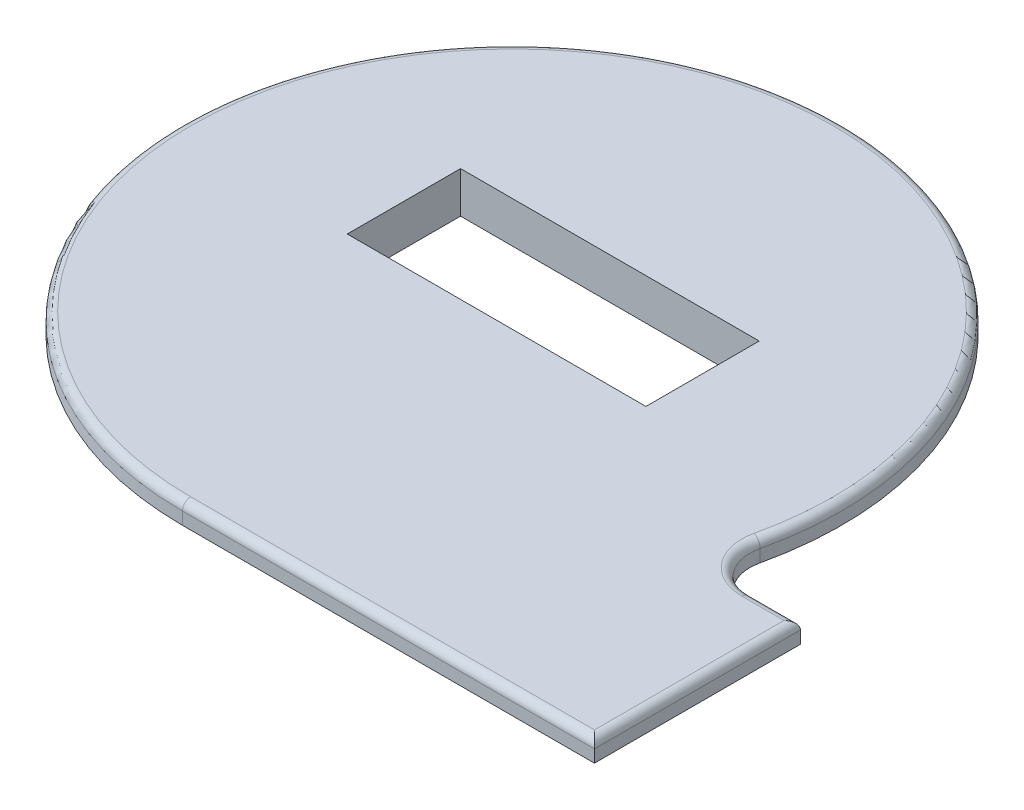
ISO-10303-21;
HEADER;
FILE_DESCRIPTION(('STEP AP214'),'2;1');
FILE_NAME('part.step','',(''),(''),'','','');
FILE_SCHEMA(('AUTOMOTIVE_DESIGN { 1 0 10303 214 1 1 1 1 }'));
ENDSEC;
DATA;
#1=APPLICATION_CONTEXT('core data for automotive mechanical design processes');
#2=APPLICATION_PROTOCOL_DEFINITION('international standard','automotive_design',2000,#1);
#3=PRODUCT_CONTEXT('',#1,'mechanical');
#4=PRODUCT('Part','Part','',(#3));
#5=PRODUCT_RELATED_PRODUCT_CATEGORY('part','',(#4));
#6=PRODUCT_DEFINITION_FORMATION('','',#4);
#7=PRODUCT_DEFINITION_CONTEXT('part definition',#1,'design');
#8=PRODUCT_DEFINITION('design','',#6,#7);
#9=PRODUCT_DEFINITION_SHAPE('','',#8);
#10=(LENGTH_UNIT() NAMED_UNIT(*) SI_UNIT(.MILLI.,.METRE.));
#11=(NAMED_UNIT(*) PLANE_ANGLE_UNIT() SI_UNIT($,.RADIAN.));
#12=(NAMED_UNIT(*) SI_UNIT($,.STERADIAN.) SOLID_ANGLE_UNIT());
#13=UNCERTAINTY_MEASURE_WITH_UNIT(LENGTH_MEASURE(1.E-05),#10,'distance_accuracy_value','');
#14=(GEOMETRIC_REPRESENTATION_CONTEXT(3) GLOBAL_UNCERTAINTY_ASSIGNED_CONTEXT((#13)) GLOBAL_UNIT_ASSIGNED_CONTEXT((#10,
#11,#12)) REPRESENTATION_CONTEXT('',''));
#15=CARTESIAN_POINT('',(0.,0.,0.));
#16=DIRECTION('',(0.,0.,1.));
#17=DIRECTION('',(1.,0.,0.));
#18=AXIS2_PLACEMENT_3D('',#15,#16,#17);
#19=CARTESIAN_POINT('',(0.,0.,0.));
#20=DIRECTION('',(0.,1.,0.));
#21=DIRECTION('',(0.,0.,1.));
#22=AXIS2_PLACEMENT_3D('',#19,#20,#21);
#23=PLANE('',#22);
#24=CARTESIAN_POINT('',(0.,0.,0.));
#25=DIRECTION('',(0.,1.,0.));
#26=DIRECTION('',(0.,0.,1.));
#27=AXIS2_PLACEMENT_3D('',#24,#25,#26);
#28=CIRCLE('',#27,80.);
#29=CARTESIAN_POINT('',(77.9996834434855,0.,17.7777777777778));
#30=VERTEX_POINT('',#29);
#31=CARTESIAN_POINT('',(0.,0.,80.));
#32=VERTEX_POINT('',#31);
#33=EDGE_CURVE('E260',#30,#32,#28,.T.);
#34=ORIENTED_EDGE('',*,*,#33,.F.);
#35=CARTESIAN_POINT('',(87.7496438739212,0.,20.));
#36=DIRECTION('',(0.,1.,0.));
#37=DIRECTION('',(0.,0.,1.));
#38=AXIS2_PLACEMENT_3D('',#35,#36,#37);
#39=CIRCLE('',#38,10.);
#40=CARTESIAN_POINT('',(87.7496438739212,0.,30.));
#41=VERTEX_POINT('',#40);
#42=EDGE_CURVE('E301',#30,#41,#39,.T.);
#43=ORIENTED_EDGE('',*,*,#42,.T.);
#44=DIRECTION('',(-1.,0.,0.));
#45=VECTOR('',#44,1.);
#46=CARTESIAN_POINT('',(100.,0.,30.));
#47=LINE('',#46,#45);
#48=CARTESIAN_POINT('',(100.,0.,30.));
#49=VERTEX_POINT('',#48);
#50=EDGE_CURVE('E272',#49,#41,#47,.T.);
#51=ORIENTED_EDGE('',*,*,#50,.F.);
#52=DIRECTION('',(0.,0.,-1.));
#53=VECTOR('',#52,1.);
#54=CARTESIAN_POINT('',(100.,0.,80.));
#55=LINE('',#54,#53);
#56=CARTESIAN_POINT('',(100.,0.,80.));
#57=VERTEX_POINT('',#56);
#58=EDGE_CURVE('E268',#57,#49,#55,.T.);
#59=ORIENTED_EDGE('',*,*,#58,.F.);
#60=DIRECTION('',(1.,0.,0.));
#61=VECTOR('',#60,1.);
#62=CARTESIAN_POINT('',(0.,0.,80.));
#63=LINE('',#62,#61);
#64=EDGE_CURVE('E264',#32,#57,#63,.T.);
#65=ORIENTED_EDGE('',*,*,#64,.F.);
#66=EDGE_LOOP('',(#34,#43,#51,#59,#65));
#67=FACE_BOUND('',#66,.T.);
#68=DIRECTION('',(1.,0.,0.));
#69=VECTOR('',#68,1.);
#70=CARTESIAN_POINT('',(94.8,0.,35.2));
#71=LINE('',#70,#69);
#72=CARTESIAN_POINT('',(80.9691299199887,0.,35.2));
#73=VERTEX_POINT('',#72);
#74=CARTESIAN_POINT('',(94.8,0.,35.2));
#75=VERTEX_POINT('',#74);
#76=EDGE_CURVE('E239',#73,#75,#71,.T.);
#77=ORIENTED_EDGE('',*,*,#76,.F.);
#78=CARTESIAN_POINT('',(80.9691299199887,0.,25.2));
#79=DIRECTION('',(0.,1.,0.));
#80=DIRECTION('',(0.,0.,1.));
#81=AXIS2_PLACEMENT_3D('',#78,#79,#80);
#82=CIRCLE('',#81,10.);
#83=CARTESIAN_POINT('',(71.4208834671598,0.,22.2283018867924));
#84=VERTEX_POINT('',#83);
#85=EDGE_CURVE('E288',#73,#84,#82,.F.);
#86=ORIENTED_EDGE('',*,*,#85,.T.);
#87=CARTESIAN_POINT('',(0.,0.,0.));
#88=DIRECTION('',(0.,-1.,0.));
#89=DIRECTION('',(0.,0.,-1.));
#90=AXIS2_PLACEMENT_3D('',#87,#88,#89);
#91=CIRCLE('',#90,74.8);
#92=CARTESIAN_POINT('',(0.,0.,74.8));
#93=VERTEX_POINT('',#92);
#94=EDGE_CURVE('E230',#93,#84,#91,.T.);
#95=ORIENTED_EDGE('',*,*,#94,.F.);
#96=DIRECTION('',(-1.,0.,0.));
#97=VECTOR('',#96,1.);
#98=CARTESIAN_POINT('',(0.,0.,74.8));
#99=LINE('',#98,#97);
#100=CARTESIAN_POINT('',(94.8,0.,74.8));
#101=VERTEX_POINT('',#100);
#102=EDGE_CURVE('E247',#101,#93,#99,.T.);
#103=ORIENTED_EDGE('',*,*,#102,.F.);
#104=DIRECTION('',(0.,0.,1.));
#105=VECTOR('',#104,1.);
#106=CARTESIAN_POINT('',(94.8,0.,74.8));
#107=LINE('',#106,#105);
#108=EDGE_CURVE('E243',#75,#101,#107,.T.);
#109=ORIENTED_EDGE('',*,*,#108,.F.);
#110=EDGE_LOOP('',(#77,#86,#95,#103,#109));
#111=FACE_BOUND('',#110,.T.);
#112=ADVANCED_FACE('F43',(#67,#111),#23,.F.);
#113=CARTESIAN_POINT('',(0.,5.,0.));
#114=DIRECTION('',(0.,-1.,0.));
#115=DIRECTION('',(0.,0.,-1.));
#116=AXIS2_PLACEMENT_3D('',#113,#114,#115);
#117=CYLINDRICAL_SURFACE('',#116,80.);
#118=DIRECTION('',(0.,-1.,0.));
#119=VECTOR('',#118,1.);
#120=CARTESIAN_POINT('',(0.,5.,80.));
#121=LINE('',#120,#119);
#122=CARTESIAN_POINT('',(0.,3.,80.));
#123=VERTEX_POINT('',#122);
#124=EDGE_CURVE('E282',#123,#32,#121,.T.);
#125=ORIENTED_EDGE('',*,*,#124,.F.);
#126=CARTESIAN_POINT('',(0.,3.,0.));
#127=DIRECTION('',(0.,1.,0.));
#128=DIRECTION('',(0.,0.,1.));
#129=AXIS2_PLACEMENT_3D('',#126,#127,#128);
#130=CIRCLE('',#129,80.);
#131=CARTESIAN_POINT('',(77.9996834434855,3.,17.7777777777778));
#132=VERTEX_POINT('',#131);
#133=EDGE_CURVE('E327',#123,#132,#130,.F.);
#134=ORIENTED_EDGE('',*,*,#133,.T.);
#135=DIRECTION('',(0.,-1.,0.));
#136=VECTOR('',#135,1.);
#137=CARTESIAN_POINT('',(77.9996834434855,5.,17.7777777777778));
#138=LINE('',#137,#136);
#139=EDGE_CURVE('E294',#132,#30,#138,.T.);
#140=ORIENTED_EDGE('',*,*,#139,.T.);
#141=ORIENTED_EDGE('',*,*,#33,.T.);
#142=EDGE_LOOP('',(#125,#134,#140,#141));
#143=FACE_BOUND('',#142,.T.);
#144=ADVANCED_FACE('F436',(#143),#117,.T.);
#145=CARTESIAN_POINT('',(0.,5.,80.));
#146=DIRECTION('',(0.,0.,-1.));
#147=DIRECTION('',(-1.,0.,0.));
#148=AXIS2_PLACEMENT_3D('',#145,#146,#147);
#149=PLANE('',#148);
#150=DIRECTION('',(0.,-1.,0.));
#151=VECTOR('',#150,1.);
#152=CARTESIAN_POINT('',(100.,5.,80.));
#153=LINE('',#152,#151);
#154=CARTESIAN_POINT('',(100.,3.,80.));
#155=VERTEX_POINT('',#154);
#156=EDGE_CURVE('E279',#155,#57,#153,.T.);
#157=ORIENTED_EDGE('',*,*,#156,.F.);
#158=DIRECTION('',(1.,0.,0.));
#159=VECTOR('',#158,1.);
#160=CARTESIAN_POINT('',(0.,3.,80.));
#161=LINE('',#160,#159);
#162=EDGE_CURVE('E330',#155,#123,#161,.F.);
#163=ORIENTED_EDGE('',*,*,#162,.T.);
#164=ORIENTED_EDGE('',*,*,#124,.T.);
#165=ORIENTED_EDGE('',*,*,#64,.T.);
#166=EDGE_LOOP('',(#157,#163,#164,#165));
#167=FACE_BOUND('',#166,.T.);
#168=ADVANCED_FACE('F443',(#167),#149,.F.);
#169=CARTESIAN_POINT('',(100.,5.,80.));
#170=DIRECTION('',(-1.,0.,0.));
#171=DIRECTION('',(0.,0.,1.));
#172=AXIS2_PLACEMENT_3D('',#169,#170,#171);
#173=PLANE('',#172);
#174=DIRECTION('',(0.,-1.,0.));
#175=VECTOR('',#174,1.);
#176=CARTESIAN_POINT('',(100.,5.,30.));
#177=LINE('',#176,#175);
#178=CARTESIAN_POINT('',(100.,3.,30.));
#179=VERTEX_POINT('',#178);
#180=EDGE_CURVE('E276',#179,#49,#177,.T.);
#181=ORIENTED_EDGE('',*,*,#180,.F.);
#182=DIRECTION('',(0.,0.,-1.));
#183=VECTOR('',#182,1.);
#184=CARTESIAN_POINT('',(100.,3.,80.));
#185=LINE('',#184,#183);
#186=EDGE_CURVE('E333',#179,#155,#185,.F.);
#187=ORIENTED_EDGE('',*,*,#186,.T.);
#188=ORIENTED_EDGE('',*,*,#156,.T.);
#189=ORIENTED_EDGE('',*,*,#58,.T.);
#190=EDGE_LOOP('',(#181,#187,#188,#189));
#191=FACE_BOUND('',#190,.T.);
#192=ADVANCED_FACE('F455',(#191),#173,.F.);
#193=CARTESIAN_POINT('',(100.,5.,30.));
#194=DIRECTION('',(0.,0.,1.));
#195=DIRECTION('',(1.,0.,0.));
#196=AXIS2_PLACEMENT_3D('',#193,#194,#195);
#197=PLANE('',#196);
#198=DIRECTION('',(0.,1.,0.));
#199=VECTOR('',#198,1.);
#200=CARTESIAN_POINT('',(87.7496438739212,5.,30.));
#201=LINE('',#200,#199);
#202=CARTESIAN_POINT('',(87.7496438739212,3.,30.));
#203=VERTEX_POINT('',#202);
#204=EDGE_CURVE('E297',#41,#203,#201,.T.);
#205=ORIENTED_EDGE('',*,*,#204,.T.);
#206=DIRECTION('',(-1.,0.,0.));
#207=VECTOR('',#206,1.);
#208=CARTESIAN_POINT('',(100.,3.,30.));
#209=LINE('',#208,#207);
#210=EDGE_CURVE('E320',#203,#179,#209,.F.);
#211=ORIENTED_EDGE('',*,*,#210,.T.);
#212=ORIENTED_EDGE('',*,*,#180,.T.);
#213=ORIENTED_EDGE('',*,*,#50,.T.);
#214=EDGE_LOOP('',(#205,#211,#212,#213));
#215=FACE_BOUND('',#214,.T.);
#216=ADVANCED_FACE('F452',(#215),#197,.F.);
#217=CARTESIAN_POINT('',(0.,5.,0.));
#218=DIRECTION('',(0.,1.,0.));
#219=DIRECTION('',(0.,0.,1.));
#220=AXIS2_PLACEMENT_3D('',#217,#218,#219);
#221=PLANE('',#220);
#222=DIRECTION('',(0.,0.,-1.));
#223=VECTOR('',#222,1.);
#224=CARTESIAN_POINT('',(98.,5.,30.));
#225=LINE('',#224,#223);
#226=CARTESIAN_POINT('',(98.,5.,78.));
#227=VERTEX_POINT('',#226);
#228=CARTESIAN_POINT('',(98.,5.,32.));
#229=VERTEX_POINT('',#228);
#230=EDGE_CURVE('E304',#227,#229,#225,.T.);
#231=ORIENTED_EDGE('',*,*,#230,.T.);
#232=DIRECTION('',(-1.,0.,0.));
#233=VECTOR('',#232,1.);
#234=CARTESIAN_POINT('',(87.7496438739212,5.,32.));
#235=LINE('',#234,#233);
#236=CARTESIAN_POINT('',(87.7496438739212,5.,32.));
#237=VERTEX_POINT('',#236);
#238=EDGE_CURVE('E316',#229,#237,#235,.T.);
#239=ORIENTED_EDGE('',*,*,#238,.T.);
#240=CARTESIAN_POINT('',(87.7496438739212,5.,20.));
#241=DIRECTION('',(0.,1.,0.));
#242=DIRECTION('',(0.,0.,1.));
#243=AXIS2_PLACEMENT_3D('',#240,#241,#242);
#244=CIRCLE('',#243,12.);
#245=CARTESIAN_POINT('',(76.0496913573984,5.,17.3333333333333));
#246=VERTEX_POINT('',#245);
#247=EDGE_CURVE('E313',#237,#246,#244,.F.);
#248=ORIENTED_EDGE('',*,*,#247,.T.);
#249=CARTESIAN_POINT('',(0.,5.,0.));
#250=DIRECTION('',(0.,1.,0.));
#251=DIRECTION('',(0.,0.,1.));
#252=AXIS2_PLACEMENT_3D('',#249,#250,#251);
#253=CIRCLE('',#252,78.);
#254=CARTESIAN_POINT('',(0.,5.,78.));
#255=VERTEX_POINT('',#254);
#256=EDGE_CURVE('E310',#246,#255,#253,.T.);
#257=ORIENTED_EDGE('',*,*,#256,.T.);
#258=DIRECTION('',(1.,0.,0.));
#259=VECTOR('',#258,1.);
#260=CARTESIAN_POINT('',(100.,5.,78.));
#261=LINE('',#260,#259);
#262=EDGE_CURVE('E307',#255,#227,#261,.T.);
#263=ORIENTED_EDGE('',*,*,#262,.T.);
#264=EDGE_LOOP('',(#231,#239,#248,#257,#263));
#265=FACE_BOUND('',#264,.T.);
#266=DIRECTION('',(0.,0.,-1.));
#267=VECTOR('',#266,1.);
#268=CARTESIAN_POINT('',(36.25,5.,3.75));
#269=LINE('',#268,#267);
#270=CARTESIAN_POINT('',(36.25,5.,3.75));
#271=VERTEX_POINT('',#270);
#272=CARTESIAN_POINT('',(36.25,5.,-23.75));
#273=VERTEX_POINT('',#272);
#274=EDGE_CURVE('E184',#271,#273,#269,.T.);
#275=ORIENTED_EDGE('',*,*,#274,.F.);
#276=DIRECTION('',(1.,0.,0.));
#277=VECTOR('',#276,1.);
#278=CARTESIAN_POINT('',(-36.25,5.,3.75));
#279=LINE('',#278,#277);
#280=CARTESIAN_POINT('',(-36.25,5.,3.75));
#281=VERTEX_POINT('',#280);
#282=EDGE_CURVE('E204',#281,#271,#279,.T.);
#283=ORIENTED_EDGE('',*,*,#282,.F.);
#284=DIRECTION('',(0.,0.,1.));
#285=VECTOR('',#284,1.);
#286=CARTESIAN_POINT('',(-36.25,5.,3.75));
#287=LINE('',#286,#285);
#288=CARTESIAN_POINT('',(-36.25,5.,-23.75));
#289=VERTEX_POINT('',#288);
#290=EDGE_CURVE('E208',#289,#281,#287,.T.);
#291=ORIENTED_EDGE('',*,*,#290,.F.);
#292=DIRECTION('',(-1.,0.,0.));
#293=VECTOR('',#292,1.);
#294=CARTESIAN_POINT('',(-36.25,5.,-23.75));
#295=LINE('',#294,#293);
#296=EDGE_CURVE('E220',#273,#289,#295,.T.);
#297=ORIENTED_EDGE('',*,*,#296,.F.);
#298=EDGE_LOOP('',(#275,#283,#291,#297));
#299=FACE_BOUND('',#298,.T.);
#300=ADVANCED_FACE('F450',(#265,#299),#221,.T.);
#301=CARTESIAN_POINT('',(0.,-5.,0.));
#302=DIRECTION('',(0.,1.,0.));
#303=DIRECTION('',(0.,0.,1.));
#304=AXIS2_PLACEMENT_3D('',#301,#302,#303);
#305=CYLINDRICAL_SURFACE('',#304,74.8);
#306=DIRECTION('',(0.,1.,0.));
#307=VECTOR('',#306,1.);
#308=CARTESIAN_POINT('',(71.4208834671598,-5.,22.2283018867924));
#309=LINE('',#308,#307);
#310=CARTESIAN_POINT('',(71.4208834671598,-3.,22.2283018867924));
#311=VERTEX_POINT('',#310);
#312=EDGE_CURVE('E291',#84,#311,#309,.F.);
#313=ORIENTED_EDGE('',*,*,#312,.T.);
#314=CARTESIAN_POINT('',(0.,-3.,0.));
#315=DIRECTION('',(0.,-1.,0.));
#316=DIRECTION('',(0.,0.,-1.));
#317=AXIS2_PLACEMENT_3D('',#314,#315,#316);
#318=CIRCLE('',#317,74.8);
#319=CARTESIAN_POINT('',(0.,-3.,74.8));
#320=VERTEX_POINT('',#319);
#321=EDGE_CURVE('E11',#311,#320,#318,.F.);
#322=ORIENTED_EDGE('',*,*,#321,.T.);
#323=DIRECTION('',(0.,1.,0.));
#324=VECTOR('',#323,1.);
#325=CARTESIAN_POINT('',(0.,-5.,74.8));
#326=LINE('',#325,#324);
#327=EDGE_CURVE('E251',#320,#93,#326,.T.);
#328=ORIENTED_EDGE('',*,*,#327,.T.);
#329=ORIENTED_EDGE('',*,*,#94,.T.);
#330=EDGE_LOOP('',(#313,#322,#328,#329));
#331=FACE_BOUND('',#330,.T.);
#332=ADVANCED_FACE('F570',(#331),#305,.T.);
#333=CARTESIAN_POINT('',(94.8,-5.,35.2));
#334=DIRECTION('',(0.,0.,1.));
#335=DIRECTION('',(1.,0.,0.));
#336=AXIS2_PLACEMENT_3D('',#333,#334,#335);
#337=PLANE('',#336);
#338=DIRECTION('',(0.,1.,0.));
#339=VECTOR('',#338,1.);
#340=CARTESIAN_POINT('',(94.8,-5.,35.2));
#341=LINE('',#340,#339);
#342=CARTESIAN_POINT('',(94.8,-3.,35.2));
#343=VERTEX_POINT('',#342);
#344=EDGE_CURVE('E257',#343,#75,#341,.T.);
#345=ORIENTED_EDGE('',*,*,#344,.F.);
#346=DIRECTION('',(1.,0.,0.));
#347=VECTOR('',#346,1.);
#348=CARTESIAN_POINT('',(80.9691299199887,-3.,35.2));
#349=LINE('',#348,#347);
#350=CARTESIAN_POINT('',(80.9691299199887,-3.,35.2));
#351=VERTEX_POINT('',#350);
#352=EDGE_CURVE('E53',#343,#351,#349,.F.);
#353=ORIENTED_EDGE('',*,*,#352,.T.);
#354=DIRECTION('',(0.,-1.,0.));
#355=VECTOR('',#354,1.);
#356=CARTESIAN_POINT('',(80.9691299199887,0.,35.2));
#357=LINE('',#356,#355);
#358=EDGE_CURVE('E285',#351,#73,#357,.F.);
#359=ORIENTED_EDGE('',*,*,#358,.T.);
#360=ORIENTED_EDGE('',*,*,#76,.T.);
#361=EDGE_LOOP('',(#345,#353,#359,#360));
#362=FACE_BOUND('',#361,.T.);
#363=ADVANCED_FACE('F418',(#362),#337,.F.);
#364=CARTESIAN_POINT('',(94.8,-5.,74.8));
#365=DIRECTION('',(-1.,0.,0.));
#366=DIRECTION('',(0.,0.,1.));
#367=AXIS2_PLACEMENT_3D('',#364,#365,#366);
#368=PLANE('',#367);
#369=DIRECTION('',(0.,1.,0.));
#370=VECTOR('',#369,1.);
#371=CARTESIAN_POINT('',(94.8,-5.,74.8));
#372=LINE('',#371,#370);
#373=CARTESIAN_POINT('',(94.8,-3.,74.8));
#374=VERTEX_POINT('',#373);
#375=EDGE_CURVE('E254',#374,#101,#372,.T.);
#376=ORIENTED_EDGE('',*,*,#375,.F.);
#377=DIRECTION('',(0.,0.,1.));
#378=VECTOR('',#377,1.);
#379=CARTESIAN_POINT('',(94.8,-3.,35.2));
#380=LINE('',#379,#378);
#381=EDGE_CURVE('E67',#374,#343,#380,.F.);
#382=ORIENTED_EDGE('',*,*,#381,.T.);
#383=ORIENTED_EDGE('',*,*,#344,.T.);
#384=ORIENTED_EDGE('',*,*,#108,.T.);
#385=EDGE_LOOP('',(#376,#382,#383,#384));
#386=FACE_BOUND('',#385,.T.);
#387=ADVANCED_FACE('F550',(#386),#368,.F.);
#388=CARTESIAN_POINT('',(0.,-5.,74.8));
#389=DIRECTION('',(0.,0.,-1.));
#390=DIRECTION('',(-1.,0.,0.));
#391=AXIS2_PLACEMENT_3D('',#388,#389,#390);
#392=PLANE('',#391);
#393=ORIENTED_EDGE('',*,*,#327,.F.);
#394=DIRECTION('',(-1.,0.,0.));
#395=VECTOR('',#394,1.);
#396=CARTESIAN_POINT('',(94.8,-3.,74.8));
#397=LINE('',#396,#395);
#398=EDGE_CURVE('E377',#320,#374,#397,.F.);
#399=ORIENTED_EDGE('',*,*,#398,.T.);
#400=ORIENTED_EDGE('',*,*,#375,.T.);
#401=ORIENTED_EDGE('',*,*,#102,.T.);
#402=EDGE_LOOP('',(#393,#399,#400,#401));
#403=FACE_BOUND('',#402,.T.);
#404=ADVANCED_FACE('F538',(#403),#392,.F.);
#405=CARTESIAN_POINT('',(0.,-5.,0.));
#406=DIRECTION('',(0.,-1.,0.));
#407=DIRECTION('',(0.,0.,-1.));
#408=AXIS2_PLACEMENT_3D('',#405,#406,#407);
#409=PLANE('',#408);
#410=CARTESIAN_POINT('',(80.9691299199887,-5.,25.2));
#411=DIRECTION('',(0.,-1.,0.));
#412=DIRECTION('',(0.,0.,-1.));
#413=AXIS2_PLACEMENT_3D('',#410,#411,#412);
#414=CIRCLE('',#413,12.);
#415=CARTESIAN_POINT('',(69.511234176594,-5.,21.6339622641509));
#416=VERTEX_POINT('',#415);
#417=CARTESIAN_POINT('',(80.9691299199887,-5.,37.2));
#418=VERTEX_POINT('',#417);
#419=EDGE_CURVE('E364',#416,#418,#414,.F.);
#420=ORIENTED_EDGE('',*,*,#419,.T.);
#421=DIRECTION('',(1.,0.,0.));
#422=VECTOR('',#421,1.);
#423=CARTESIAN_POINT('',(94.8,-5.,37.2));
#424=LINE('',#423,#422);
#425=CARTESIAN_POINT('',(92.8,-5.,37.2));
#426=VERTEX_POINT('',#425);
#427=EDGE_CURVE('E368',#418,#426,#424,.T.);
#428=ORIENTED_EDGE('',*,*,#427,.T.);
#429=DIRECTION('',(0.,0.,1.));
#430=VECTOR('',#429,1.);
#431=CARTESIAN_POINT('',(92.8,-5.,74.8));
#432=LINE('',#431,#430);
#433=CARTESIAN_POINT('',(92.8,-5.,72.8));
#434=VERTEX_POINT('',#433);
#435=EDGE_CURVE('E361',#426,#434,#432,.T.);
#436=ORIENTED_EDGE('',*,*,#435,.T.);
#437=DIRECTION('',(-1.,0.,0.));
#438=VECTOR('',#437,1.);
#439=CARTESIAN_POINT('',(0.,-5.,72.8));
#440=LINE('',#439,#438);
#441=CARTESIAN_POINT('',(0.,-5.,72.8));
#442=VERTEX_POINT('',#441);
#443=EDGE_CURVE('E358',#434,#442,#440,.T.);
#444=ORIENTED_EDGE('',*,*,#443,.T.);
#445=CARTESIAN_POINT('',(0.,-5.,0.));
#446=DIRECTION('',(0.,-1.,0.));
#447=DIRECTION('',(0.,0.,-1.));
#448=AXIS2_PLACEMENT_3D('',#445,#446,#447);
#449=CIRCLE('',#448,72.8);
#450=EDGE_CURVE('E336',#442,#416,#449,.T.);
#451=ORIENTED_EDGE('',*,*,#450,.T.);
#452=EDGE_LOOP('',(#420,#428,#436,#444,#451));
#453=FACE_BOUND('',#452,.T.);
#454=CARTESIAN_POINT('',(-37.5,-5.,-25.5));
#455=DIRECTION('',(0.,-1.,0.));
#456=DIRECTION('',(0.,0.,-1.));
#457=AXIS2_PLACEMENT_3D('',#454,#455,#456);
#458=CIRCLE('',#457,1.5);
#459=CARTESIAN_POINT('',(-37.5,-5.,-27.));
#460=VERTEX_POINT('',#459);
#461=EDGE_CURVE('E828',#460,#460,#458,.T.);
#462=ORIENTED_EDGE('',*,*,#461,.F.);
#463=EDGE_LOOP('',(#462));
#464=FACE_BOUND('',#463,.T.);
#465=CARTESIAN_POINT('',(37.5,-5.,-25.5));
#466=DIRECTION('',(0.,-1.,0.));
#467=DIRECTION('',(0.,0.,-1.));
#468=AXIS2_PLACEMENT_3D('',#465,#466,#467);
#469=CIRCLE('',#468,1.5);
#470=CARTESIAN_POINT('',(37.5,-5.,-27.));
#471=VERTEX_POINT('',#470);
#472=EDGE_CURVE('E851',#471,#471,#469,.T.);
#473=ORIENTED_EDGE('',*,*,#472,.F.);
#474=EDGE_LOOP('',(#473));
#475=FACE_BOUND('',#474,.T.);
#476=CARTESIAN_POINT('',(37.5,-5.,5.50000000000003));
#477=DIRECTION('',(0.,-1.,0.));
#478=DIRECTION('',(0.,0.,-1.));
#479=AXIS2_PLACEMENT_3D('',#476,#477,#478);
#480=CIRCLE('',#479,1.5);
#481=CARTESIAN_POINT('',(37.5,-5.,4.00000000000002));
#482=VERTEX_POINT('',#481);
#483=EDGE_CURVE('E840',#482,#482,#480,.T.);
#484=ORIENTED_EDGE('',*,*,#483,.F.);
#485=EDGE_LOOP('',(#484));
#486=FACE_BOUND('',#485,.T.);
#487=CARTESIAN_POINT('',(-37.5,-5.,5.50000000000001));
#488=DIRECTION('',(0.,-1.,0.));
#489=DIRECTION('',(0.,0.,-1.));
#490=AXIS2_PLACEMENT_3D('',#487,#488,#489);
#491=CIRCLE('',#490,1.5);
#492=CARTESIAN_POINT('',(-37.5,-5.,4.));
#493=VERTEX_POINT('',#492);
#494=EDGE_CURVE('E211',#493,#493,#491,.T.);
#495=ORIENTED_EDGE('',*,*,#494,.F.);
#496=EDGE_LOOP('',(#495));
#497=FACE_BOUND('',#496,.T.);
#498=DIRECTION('',(0.,0.,-1.));
#499=VECTOR('',#498,1.);
#500=CARTESIAN_POINT('',(36.25,-5.,3.75));
#501=LINE('',#500,#499);
#502=CARTESIAN_POINT('',(36.25,-5.,3.75));
#503=VERTEX_POINT('',#502);
#504=CARTESIAN_POINT('',(36.25,-5.,-23.75));
#505=VERTEX_POINT('',#504);
#506=EDGE_CURVE('E181',#503,#505,#501,.T.);
#507=ORIENTED_EDGE('',*,*,#506,.T.);
#508=DIRECTION('',(-1.,0.,0.));
#509=VECTOR('',#508,1.);
#510=CARTESIAN_POINT('',(-36.25,-5.,-23.75));
#511=LINE('',#510,#509);
#512=CARTESIAN_POINT('',(-36.25,-5.,-23.75));
#513=VERTEX_POINT('',#512);
#514=EDGE_CURVE('E194',#505,#513,#511,.T.);
#515=ORIENTED_EDGE('',*,*,#514,.T.);
#516=DIRECTION('',(0.,0.,1.));
#517=VECTOR('',#516,1.);
#518=CARTESIAN_POINT('',(-36.25,-5.,3.75));
#519=LINE('',#518,#517);
#520=CARTESIAN_POINT('',(-36.25,-5.,3.75));
#521=VERTEX_POINT('',#520);
#522=EDGE_CURVE('E199',#513,#521,#519,.T.);
#523=ORIENTED_EDGE('',*,*,#522,.T.);
#524=DIRECTION('',(1.,0.,0.));
#525=VECTOR('',#524,1.);
#526=CARTESIAN_POINT('',(-36.25,-5.,3.75));
#527=LINE('',#526,#525);
#528=EDGE_CURVE('E190',#521,#503,#527,.T.);
#529=ORIENTED_EDGE('',*,*,#528,.T.);
#530=EDGE_LOOP('',(#507,#515,#523,#529));
#531=FACE_BOUND('',#530,.T.);
#532=ADVANCED_FACE('F201',(#453,#464,#475,#486,#497,#531),#409,.T.);
#533=CARTESIAN_POINT('',(36.25,-5.,3.75));
#534=DIRECTION('',(1.,0.,0.));
#535=DIRECTION('',(0.,0.,-1.));
#536=AXIS2_PLACEMENT_3D('',#533,#534,#535);
#537=PLANE('',#536);
#538=ORIENTED_EDGE('',*,*,#274,.T.);
#539=DIRECTION('',(0.,1.,0.));
#540=VECTOR('',#539,1.);
#541=CARTESIAN_POINT('',(36.25,-5.,-23.75));
#542=LINE('',#541,#540);
#543=EDGE_CURVE('E177',#505,#273,#542,.T.);
#544=ORIENTED_EDGE('',*,*,#543,.F.);
#545=ORIENTED_EDGE('',*,*,#506,.F.);
#546=DIRECTION('',(0.,1.,0.));
#547=VECTOR('',#546,1.);
#548=CARTESIAN_POINT('',(36.25,-5.,3.75));
#549=LINE('',#548,#547);
#550=EDGE_CURVE('E227',#503,#271,#549,.T.);
#551=ORIENTED_EDGE('',*,*,#550,.T.);
#552=EDGE_LOOP('',(#538,#544,#545,#551));
#553=FACE_BOUND('',#552,.T.);
#554=ADVANCED_FACE('F179',(#553),#537,.F.);
#555=CARTESIAN_POINT('',(-36.25,-5.,3.75));
#556=DIRECTION('',(0.,0.,1.));
#557=DIRECTION('',(1.,0.,0.));
#558=AXIS2_PLACEMENT_3D('',#555,#556,#557);
#559=PLANE('',#558);
#560=ORIENTED_EDGE('',*,*,#282,.T.);
#561=ORIENTED_EDGE('',*,*,#550,.F.);
#562=ORIENTED_EDGE('',*,*,#528,.F.);
#563=DIRECTION('',(0.,1.,0.));
#564=VECTOR('',#563,1.);
#565=CARTESIAN_POINT('',(-36.25,-5.,3.75));
#566=LINE('',#565,#564);
#567=EDGE_CURVE('E231',#521,#281,#566,.T.);
#568=ORIENTED_EDGE('',*,*,#567,.T.);
#569=EDGE_LOOP('',(#560,#561,#562,#568));
#570=FACE_BOUND('',#569,.T.);
#571=ADVANCED_FACE('F679',(#570),#559,.F.);
#572=CARTESIAN_POINT('',(-36.25,-5.,3.75));
#573=DIRECTION('',(-1.,0.,0.));
#574=DIRECTION('',(0.,0.,1.));
#575=AXIS2_PLACEMENT_3D('',#572,#573,#574);
#576=PLANE('',#575);
#577=ORIENTED_EDGE('',*,*,#290,.T.);
#578=ORIENTED_EDGE('',*,*,#567,.F.);
#579=ORIENTED_EDGE('',*,*,#522,.F.);
#580=DIRECTION('',(0.,1.,0.));
#581=VECTOR('',#580,1.);
#582=CARTESIAN_POINT('',(-36.25,-5.,-23.75));
#583=LINE('',#582,#581);
#584=EDGE_CURVE('E189',#513,#289,#583,.T.);
#585=ORIENTED_EDGE('',*,*,#584,.T.);
#586=EDGE_LOOP('',(#577,#578,#579,#585));
#587=FACE_BOUND('',#586,.T.);
#588=ADVANCED_FACE('F688',(#587),#576,.F.);
#589=CARTESIAN_POINT('',(-36.25,-5.,-23.75));
#590=DIRECTION('',(0.,0.,-1.));
#591=DIRECTION('',(-1.,0.,0.));
#592=AXIS2_PLACEMENT_3D('',#589,#590,#591);
#593=PLANE('',#592);
#594=ORIENTED_EDGE('',*,*,#296,.T.);
#595=ORIENTED_EDGE('',*,*,#584,.F.);
#596=ORIENTED_EDGE('',*,*,#514,.F.);
#597=ORIENTED_EDGE('',*,*,#543,.T.);
#598=EDGE_LOOP('',(#594,#595,#596,#597));
#599=FACE_BOUND('',#598,.T.);
#600=ADVANCED_FACE('F195',(#599),#593,.F.);
#601=CARTESIAN_POINT('',(-37.5,0.,5.50000000000001));
#602=DIRECTION('',(0.,-1.,0.));
#603=DIRECTION('',(0.,0.,-1.));
#604=AXIS2_PLACEMENT_3D('',#601,#602,#603);
#605=CYLINDRICAL_SURFACE('',#604,1.5);
#606=CARTESIAN_POINT('',(-37.5,0.,5.50000000000001));
#607=DIRECTION('',(0.,-1.,0.));
#608=DIRECTION('',(0.,0.,-1.));
#609=AXIS2_PLACEMENT_3D('',#606,#607,#608);
#610=CIRCLE('',#609,1.5);
#611=CARTESIAN_POINT('',(-37.5,0.,4.));
#612=VERTEX_POINT('',#611);
#613=EDGE_CURVE('E221',#612,#612,#610,.T.);
#614=ORIENTED_EDGE('',*,*,#613,.F.);
#615=EDGE_LOOP('',(#614));
#616=FACE_BOUND('',#615,.T.);
#617=ORIENTED_EDGE('',*,*,#494,.T.);
#618=EDGE_LOOP('',(#617));
#619=FACE_BOUND('',#618,.T.);
#620=ADVANCED_FACE('F707',(#616,#619),#605,.F.);
#621=CARTESIAN_POINT('',(-37.5,0.,5.50000000000001));
#622=DIRECTION('',(0.,-1.,0.));
#623=DIRECTION('',(0.,0.,-1.));
#624=AXIS2_PLACEMENT_3D('',#621,#622,#623);
#625=PLANE('',#624);
#626=ORIENTED_EDGE('',*,*,#613,.T.);
#627=EDGE_LOOP('',(#626));
#628=FACE_BOUND('',#627,.T.);
#629=ADVANCED_FACE('F716',(#628),#625,.T.);
#630=CARTESIAN_POINT('',(37.5,0.,5.50000000000003));
#631=DIRECTION('',(0.,-1.,0.));
#632=DIRECTION('',(0.,0.,-1.));
#633=AXIS2_PLACEMENT_3D('',#630,#631,#632);
#634=CYLINDRICAL_SURFACE('',#633,1.5);
#635=CARTESIAN_POINT('',(37.5,0.,5.50000000000003));
#636=DIRECTION('',(0.,-1.,0.));
#637=DIRECTION('',(0.,0.,-1.));
#638=AXIS2_PLACEMENT_3D('',#635,#636,#637);
#639=CIRCLE('',#638,1.5);
#640=CARTESIAN_POINT('',(37.5,0.,4.00000000000002));
#641=VERTEX_POINT('',#640);
#642=EDGE_CURVE('E845',#641,#641,#639,.T.);
#643=ORIENTED_EDGE('',*,*,#642,.F.);
#644=EDGE_LOOP('',(#643));
#645=FACE_BOUND('',#644,.T.);
#646=ORIENTED_EDGE('',*,*,#483,.T.);
#647=EDGE_LOOP('',(#646));
#648=FACE_BOUND('',#647,.T.);
#649=ADVANCED_FACE('F726',(#645,#648),#634,.F.);
#650=CARTESIAN_POINT('',(37.5,0.,5.50000000000003));
#651=DIRECTION('',(0.,-1.,0.));
#652=DIRECTION('',(0.,0.,-1.));
#653=AXIS2_PLACEMENT_3D('',#650,#651,#652);
#654=PLANE('',#653);
#655=ORIENTED_EDGE('',*,*,#642,.T.);
#656=EDGE_LOOP('',(#655));
#657=FACE_BOUND('',#656,.T.);
#658=ADVANCED_FACE('F736',(#657),#654,.T.);
#659=CARTESIAN_POINT('',(37.5,0.,-25.5));
#660=DIRECTION('',(0.,-1.,0.));
#661=DIRECTION('',(0.,0.,-1.));
#662=AXIS2_PLACEMENT_3D('',#659,#660,#661);
#663=CYLINDRICAL_SURFACE('',#662,1.5);
#664=CARTESIAN_POINT('',(37.5,0.,-25.5));
#665=DIRECTION('',(0.,-1.,0.));
#666=DIRECTION('',(0.,0.,-1.));
#667=AXIS2_PLACEMENT_3D('',#664,#665,#666);
#668=CIRCLE('',#667,1.5);
#669=CARTESIAN_POINT('',(37.5,0.,-27.));
#670=VERTEX_POINT('',#669);
#671=EDGE_CURVE('E832',#670,#670,#668,.T.);
#672=ORIENTED_EDGE('',*,*,#671,.F.);
#673=EDGE_LOOP('',(#672));
#674=FACE_BOUND('',#673,.T.);
#675=ORIENTED_EDGE('',*,*,#472,.T.);
#676=EDGE_LOOP('',(#675));
#677=FACE_BOUND('',#676,.T.);
#678=ADVANCED_FACE('F746',(#674,#677),#663,.F.);
#679=CARTESIAN_POINT('',(37.5,0.,-25.5));
#680=DIRECTION('',(0.,-1.,0.));
#681=DIRECTION('',(0.,0.,-1.));
#682=AXIS2_PLACEMENT_3D('',#679,#680,#681);
#683=PLANE('',#682);
#684=ORIENTED_EDGE('',*,*,#671,.T.);
#685=EDGE_LOOP('',(#684));
#686=FACE_BOUND('',#685,.T.);
#687=ADVANCED_FACE('F756',(#686),#683,.T.);
#688=CARTESIAN_POINT('',(-37.5,0.,-25.5));
#689=DIRECTION('',(0.,-1.,0.));
#690=DIRECTION('',(0.,0.,-1.));
#691=AXIS2_PLACEMENT_3D('',#688,#689,#690);
#692=CYLINDRICAL_SURFACE('',#691,1.5);
#693=CARTESIAN_POINT('',(-37.5,0.,-25.5));
#694=DIRECTION('',(0.,-1.,0.));
#695=DIRECTION('',(0.,0.,-1.));
#696=AXIS2_PLACEMENT_3D('',#693,#694,#695);
#697=CIRCLE('',#696,1.5);
#698=CARTESIAN_POINT('',(-37.5,0.,-27.));
#699=VERTEX_POINT('',#698);
#700=EDGE_CURVE('E355',#699,#699,#697,.T.);
#701=ORIENTED_EDGE('',*,*,#700,.F.);
#702=EDGE_LOOP('',(#701));
#703=FACE_BOUND('',#702,.T.);
#704=ORIENTED_EDGE('',*,*,#461,.T.);
#705=EDGE_LOOP('',(#704));
#706=FACE_BOUND('',#705,.T.);
#707=ADVANCED_FACE('F766',(#703,#706),#692,.F.);
#708=CARTESIAN_POINT('',(-37.5,0.,-25.5));
#709=DIRECTION('',(0.,-1.,0.));
#710=DIRECTION('',(0.,0.,-1.));
#711=AXIS2_PLACEMENT_3D('',#708,#709,#710);
#712=PLANE('',#711);
#713=ORIENTED_EDGE('',*,*,#700,.T.);
#714=EDGE_LOOP('',(#713));
#715=FACE_BOUND('',#714,.T.);
#716=ADVANCED_FACE('F466',(#715),#712,.T.);
#717=CARTESIAN_POINT('',(80.9691299199887,-5.,25.2));
#718=DIRECTION('',(0.,1.,0.));
#719=DIRECTION('',(0.,0.,1.));
#720=AXIS2_PLACEMENT_3D('',#717,#718,#719);
#721=CYLINDRICAL_SURFACE('',#720,10.);
#722=ORIENTED_EDGE('',*,*,#358,.F.);
#723=CARTESIAN_POINT('',(80.9691299199887,-3.,25.2));
#724=DIRECTION('',(0.,-1.,0.));
#725=DIRECTION('',(0.,0.,-1.));
#726=AXIS2_PLACEMENT_3D('',#723,#724,#725);
#727=CIRCLE('',#726,10.);
#728=EDGE_CURVE('E371',#351,#311,#727,.T.);
#729=ORIENTED_EDGE('',*,*,#728,.T.);
#730=ORIENTED_EDGE('',*,*,#312,.F.);
#731=ORIENTED_EDGE('',*,*,#85,.F.);
#732=EDGE_LOOP('',(#722,#729,#730,#731));
#733=FACE_BOUND('',#732,.T.);
#734=ADVANCED_FACE('F422',(#733),#721,.F.);
#735=CARTESIAN_POINT('',(87.7496438739212,5.,20.));
#736=DIRECTION('',(0.,-1.,0.));
#737=DIRECTION('',(0.,0.,-1.));
#738=AXIS2_PLACEMENT_3D('',#735,#736,#737);
#739=CYLINDRICAL_SURFACE('',#738,10.);
#740=ORIENTED_EDGE('',*,*,#139,.F.);
#741=CARTESIAN_POINT('',(87.7496438739212,3.,20.));
#742=DIRECTION('',(0.,1.,0.));
#743=DIRECTION('',(0.,0.,1.));
#744=AXIS2_PLACEMENT_3D('',#741,#742,#743);
#745=CIRCLE('',#744,10.);
#746=EDGE_CURVE('E324',#132,#203,#745,.T.);
#747=ORIENTED_EDGE('',*,*,#746,.T.);
#748=ORIENTED_EDGE('',*,*,#204,.F.);
#749=ORIENTED_EDGE('',*,*,#42,.F.);
#750=EDGE_LOOP('',(#740,#747,#748,#749));
#751=FACE_BOUND('',#750,.T.);
#752=ADVANCED_FACE('F465',(#751),#739,.F.);
#753=CARTESIAN_POINT('',(0.,3.,78.));
#754=DIRECTION('',(-1.,0.,0.));
#755=DIRECTION('',(0.,0.,1.));
#756=AXIS2_PLACEMENT_3D('',#753,#754,#755);
#757=CYLINDRICAL_SURFACE('',#756,2.);
#758=CARTESIAN_POINT('',(98.,3.,78.));
#759=DIRECTION('',(-0.707106781186547,0.,0.707106781186547));
#760=DIRECTION('',(0.707106781186547,0.,0.707106781186547));
#761=AXIS2_PLACEMENT_3D('',#758,#759,#760);
#762=ELLIPSE('',#761,2.82842712474619,2.);
#763=EDGE_CURVE('E347',#227,#155,#762,.F.);
#764=ORIENTED_EDGE('',*,*,#763,.F.);
#765=ORIENTED_EDGE('',*,*,#262,.F.);
#766=CARTESIAN_POINT('',(0.,3.,78.));
#767=DIRECTION('',(-1.,0.,0.));
#768=DIRECTION('',(0.,0.,1.));
#769=AXIS2_PLACEMENT_3D('',#766,#767,#768);
#770=CIRCLE('',#769,2.);
#771=EDGE_CURVE('E351',#123,#255,#770,.T.);
#772=ORIENTED_EDGE('',*,*,#771,.F.);
#773=ORIENTED_EDGE('',*,*,#162,.F.);
#774=EDGE_LOOP('',(#764,#765,#772,#773));
#775=FACE_BOUND('',#774,.T.);
#776=ADVANCED_FACE('F469',(#775),#757,.T.);
#777=CARTESIAN_POINT('',(0.,3.,0.));
#778=DIRECTION('',(0.,1.,0.));
#779=DIRECTION('',(0.,0.,1.));
#780=AXIS2_PLACEMENT_3D('',#777,#778,#779);
#781=TOROIDAL_SURFACE('',#780,78.,2.);
#782=ORIENTED_EDGE('',*,*,#771,.T.);
#783=ORIENTED_EDGE('',*,*,#256,.F.);
#784=CARTESIAN_POINT('',(76.0496913573984,3.,17.3333333333333));
#785=DIRECTION('',(-0.222222222222223,0.,0.974996043043569));
#786=DIRECTION('',(0.974996043043569,0.,0.222222222222223));
#787=AXIS2_PLACEMENT_3D('',#784,#785,#786);
#788=CIRCLE('',#787,2.);
#789=EDGE_CURVE('E343',#132,#246,#788,.T.);
#790=ORIENTED_EDGE('',*,*,#789,.F.);
#791=ORIENTED_EDGE('',*,*,#133,.F.);
#792=EDGE_LOOP('',(#782,#783,#790,#791));
#793=FACE_BOUND('',#792,.T.);
#794=ADVANCED_FACE('F482',(#793),#781,.T.);
#795=CARTESIAN_POINT('',(98.,3.,0.));
#796=DIRECTION('',(0.,0.,1.));
#797=DIRECTION('',(1.,0.,0.));
#798=AXIS2_PLACEMENT_3D('',#795,#796,#797);
#799=CYLINDRICAL_SURFACE('',#798,2.);
#800=ORIENTED_EDGE('',*,*,#763,.T.);
#801=ORIENTED_EDGE('',*,*,#186,.F.);
#802=CARTESIAN_POINT('',(98.,3.,32.));
#803=DIRECTION('',(0.707106781186547,0.,0.707106781186547));
#804=DIRECTION('',(-0.707106781186547,0.,0.707106781186547));
#805=AXIS2_PLACEMENT_3D('',#802,#803,#804);
#806=ELLIPSE('',#805,2.82842712474619,2.);
#807=EDGE_CURVE('E340',#229,#179,#806,.F.);
#808=ORIENTED_EDGE('',*,*,#807,.F.);
#809=ORIENTED_EDGE('',*,*,#230,.F.);
#810=EDGE_LOOP('',(#800,#801,#808,#809));
#811=FACE_BOUND('',#810,.T.);
#812=ADVANCED_FACE('F478',(#811),#799,.T.);
#813=CARTESIAN_POINT('',(87.7496438739212,3.,20.));
#814=DIRECTION('',(0.,1.,0.));
#815=DIRECTION('',(0.,0.,1.));
#816=AXIS2_PLACEMENT_3D('',#813,#814,#815);
#817=TOROIDAL_SURFACE('',#816,12.,2.);
#818=ORIENTED_EDGE('',*,*,#789,.T.);
#819=ORIENTED_EDGE('',*,*,#247,.F.);
#820=CARTESIAN_POINT('',(87.7496438739212,3.,32.));
#821=DIRECTION('',(1.,0.,0.));
#822=DIRECTION('',(0.,0.,-1.));
#823=AXIS2_PLACEMENT_3D('',#820,#821,#822);
#824=CIRCLE('',#823,2.);
#825=EDGE_CURVE('E337',#203,#237,#824,.T.);
#826=ORIENTED_EDGE('',*,*,#825,.F.);
#827=ORIENTED_EDGE('',*,*,#746,.F.);
#828=EDGE_LOOP('',(#818,#819,#826,#827));
#829=FACE_BOUND('',#828,.T.);
#830=ADVANCED_FACE('F474',(#829),#817,.T.);
#831=CARTESIAN_POINT('',(0.,3.,32.));
#832=DIRECTION('',(1.,0.,0.));
#833=DIRECTION('',(0.,0.,-1.));
#834=AXIS2_PLACEMENT_3D('',#831,#832,#833);
#835=CYLINDRICAL_SURFACE('',#834,2.);
#836=ORIENTED_EDGE('',*,*,#807,.T.);
#837=ORIENTED_EDGE('',*,*,#210,.F.);
#838=ORIENTED_EDGE('',*,*,#825,.T.);
#839=ORIENTED_EDGE('',*,*,#238,.F.);
#840=EDGE_LOOP('',(#836,#837,#838,#839));
#841=FACE_BOUND('',#840,.T.);
#842=ADVANCED_FACE('F471',(#841),#835,.T.);
#843=CARTESIAN_POINT('',(0.,-3.,72.8));
#844=DIRECTION('',(1.,0.,0.));
#845=DIRECTION('',(0.,0.,-1.));
#846=AXIS2_PLACEMENT_3D('',#843,#844,#845);
#847=CYLINDRICAL_SURFACE('',#846,2.);
#848=CARTESIAN_POINT('',(0.,-3.,72.8));
#849=DIRECTION('',(-1.,0.,0.));
#850=DIRECTION('',(0.,0.,1.));
#851=AXIS2_PLACEMENT_3D('',#848,#849,#850);
#852=CIRCLE('',#851,2.);
#853=EDGE_CURVE('E391',#442,#320,#852,.T.);
#854=ORIENTED_EDGE('',*,*,#853,.F.);
#855=ORIENTED_EDGE('',*,*,#443,.F.);
#856=CARTESIAN_POINT('',(92.8,-3.,72.8));
#857=DIRECTION('',(0.707106781186547,0.,-0.707106781186547));
#858=DIRECTION('',(0.707106781186547,0.,0.707106781186547));
#859=AXIS2_PLACEMENT_3D('',#856,#857,#858);
#860=ELLIPSE('',#859,2.82842712474619,2.);
#861=EDGE_CURVE('E47',#374,#434,#860,.T.);
#862=ORIENTED_EDGE('',*,*,#861,.F.);
#863=ORIENTED_EDGE('',*,*,#398,.F.);
#864=EDGE_LOOP('',(#854,#855,#862,#863));
#865=FACE_BOUND('',#864,.T.);
#866=ADVANCED_FACE('F45',(#865),#847,.T.);
#867=CARTESIAN_POINT('',(92.8,-3.,0.));
#868=DIRECTION('',(0.,0.,-1.));
#869=DIRECTION('',(-1.,0.,0.));
#870=AXIS2_PLACEMENT_3D('',#867,#868,#869);
#871=CYLINDRICAL_SURFACE('',#870,2.);
#872=ORIENTED_EDGE('',*,*,#861,.T.);
#873=ORIENTED_EDGE('',*,*,#435,.F.);
#874=CARTESIAN_POINT('',(92.8,-3.,37.2));
#875=DIRECTION('',(-0.707106781186547,0.,-0.707106781186548));
#876=DIRECTION('',(-0.707106781186548,0.,0.707106781186547));
#877=AXIS2_PLACEMENT_3D('',#874,#875,#876);
#878=ELLIPSE('',#877,2.82842712474619,2.);
#879=EDGE_CURVE('E388',#343,#426,#878,.T.);
#880=ORIENTED_EDGE('',*,*,#879,.F.);
#881=ORIENTED_EDGE('',*,*,#381,.F.);
#882=EDGE_LOOP('',(#872,#873,#880,#881));
#883=FACE_BOUND('',#882,.T.);
#884=ADVANCED_FACE('F402',(#883),#871,.T.);
#885=CARTESIAN_POINT('',(0.,-3.,0.));
#886=DIRECTION('',(0.,-1.,0.));
#887=DIRECTION('',(0.,0.,-1.));
#888=AXIS2_PLACEMENT_3D('',#885,#886,#887);
#889=TOROIDAL_SURFACE('',#888,72.8,2.);
#890=ORIENTED_EDGE('',*,*,#853,.T.);
#891=ORIENTED_EDGE('',*,*,#321,.F.);
#892=CARTESIAN_POINT('',(69.511234176594,-3.,21.6339622641509));
#893=DIRECTION('',(-0.297169811320756,0.,0.954824645282885));
#894=DIRECTION('',(0.954824645282885,0.,0.297169811320756));
#895=AXIS2_PLACEMENT_3D('',#892,#893,#894);
#896=CIRCLE('',#895,2.);
#897=EDGE_CURVE('E385',#416,#311,#896,.T.);
#898=ORIENTED_EDGE('',*,*,#897,.F.);
#899=ORIENTED_EDGE('',*,*,#450,.F.);
#900=EDGE_LOOP('',(#890,#891,#898,#899));
#901=FACE_BOUND('',#900,.T.);
#902=ADVANCED_FACE('F427',(#901),#889,.T.);
#903=CARTESIAN_POINT('',(0.,-3.,37.2));
#904=DIRECTION('',(-1.,0.,0.));
#905=DIRECTION('',(0.,0.,1.));
#906=AXIS2_PLACEMENT_3D('',#903,#904,#905);
#907=CYLINDRICAL_SURFACE('',#906,2.);
#908=ORIENTED_EDGE('',*,*,#879,.T.);
#909=ORIENTED_EDGE('',*,*,#427,.F.);
#910=CARTESIAN_POINT('',(80.9691299199887,-3.,37.2));
#911=DIRECTION('',(-1.,0.,0.));
#912=DIRECTION('',(0.,0.,1.));
#913=AXIS2_PLACEMENT_3D('',#910,#911,#912);
#914=CIRCLE('',#913,2.);
#915=EDGE_CURVE('E382',#351,#418,#914,.T.);
#916=ORIENTED_EDGE('',*,*,#915,.F.);
#917=ORIENTED_EDGE('',*,*,#352,.F.);
#918=EDGE_LOOP('',(#908,#909,#916,#917));
#919=FACE_BOUND('',#918,.T.);
#920=ADVANCED_FACE('F414',(#919),#907,.T.);
#921=CARTESIAN_POINT('',(80.9691299199887,-3.,25.2));
#922=DIRECTION('',(0.,-1.,0.));
#923=DIRECTION('',(0.,0.,-1.));
#924=AXIS2_PLACEMENT_3D('',#921,#922,#923);
#925=TOROIDAL_SURFACE('',#924,12.,2.);
#926=ORIENTED_EDGE('',*,*,#897,.T.);
#927=ORIENTED_EDGE('',*,*,#728,.F.);
#928=ORIENTED_EDGE('',*,*,#915,.T.);
#929=ORIENTED_EDGE('',*,*,#419,.F.);
#930=EDGE_LOOP('',(#926,#927,#928,#929));
#931=FACE_BOUND('',#930,.T.);
#932=ADVANCED_FACE('F426',(#931),#925,.T.);
#933=CLOSED_SHELL('',(#112,#144,#168,#192,#216,#300,#332,#363,#387,#404,#532,#554,#571,#588,
#600,#620,#629,#649,#658,#678,#687,#707,#716,#734,#752,#776,#794,#812,#830,#842,#866,#884,#902,
#920,#932));
#934=MANIFOLD_SOLID_BREP('B2',#933);
#935=ADVANCED_BREP_SHAPE_REPRESENTATION('',(#18,#934),#14);
#936=SHAPE_DEFINITION_REPRESENTATION(#9,#935);
ENDSEC;
END-ISO-10303-21;
